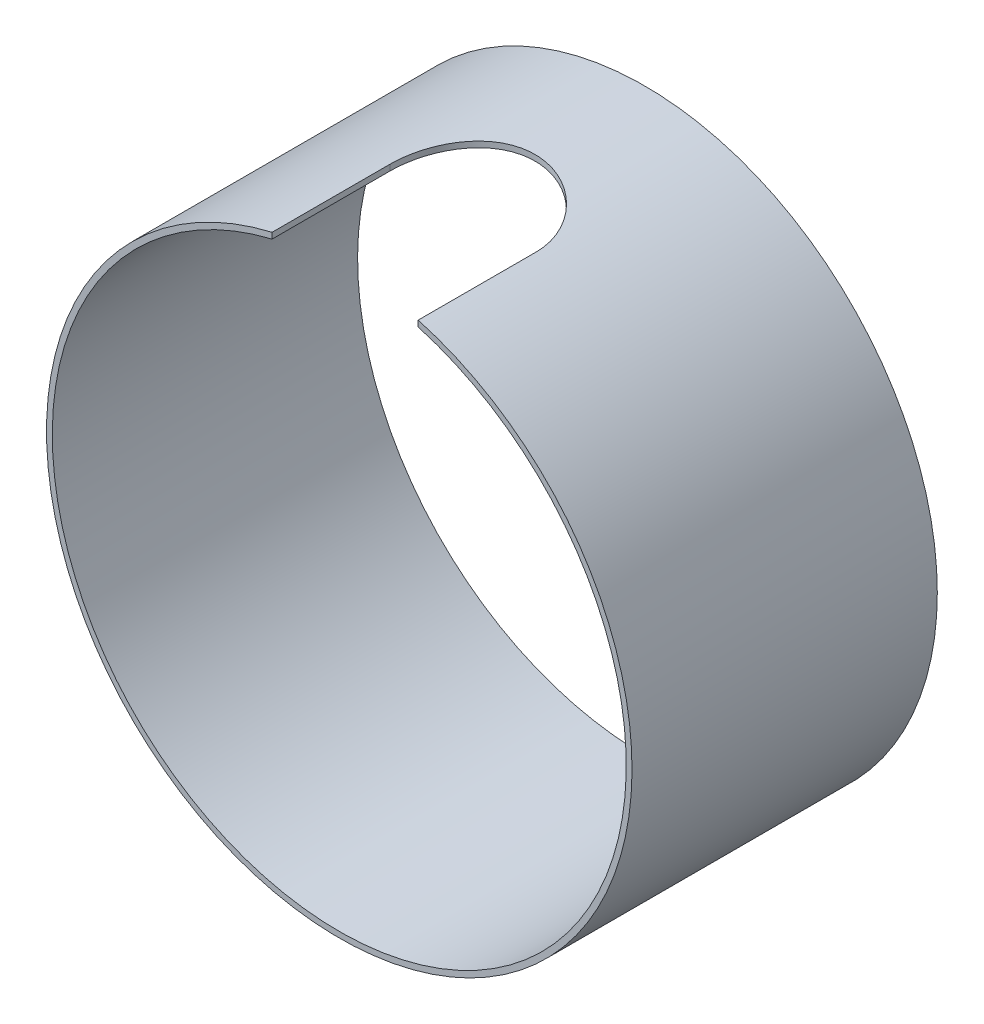
ISO-10303-21;
HEADER;
FILE_DESCRIPTION(('STEP AP214'),'2;1');
FILE_NAME('part.step','',(''),(''),'','','');
FILE_SCHEMA(('AUTOMOTIVE_DESIGN { 1 0 10303 214 1 1 1 1 }'));
ENDSEC;
DATA;
#1=APPLICATION_CONTEXT('core data for automotive mechanical design processes');
#2=APPLICATION_PROTOCOL_DEFINITION('international standard','automotive_design',2000,#1);
#3=PRODUCT_CONTEXT('',#1,'mechanical');
#4=PRODUCT('Part','Part','',(#3));
#5=PRODUCT_RELATED_PRODUCT_CATEGORY('part','',(#4));
#6=PRODUCT_DEFINITION_FORMATION('','',#4);
#7=PRODUCT_DEFINITION_CONTEXT('part definition',#1,'design');
#8=PRODUCT_DEFINITION('design','',#6,#7);
#9=PRODUCT_DEFINITION_SHAPE('','',#8);
#10=(LENGTH_UNIT() NAMED_UNIT(*) SI_UNIT(.MILLI.,.METRE.));
#11=(NAMED_UNIT(*) PLANE_ANGLE_UNIT() SI_UNIT($,.RADIAN.));
#12=(NAMED_UNIT(*) SI_UNIT($,.STERADIAN.) SOLID_ANGLE_UNIT());
#13=UNCERTAINTY_MEASURE_WITH_UNIT(LENGTH_MEASURE(1.E-05),#10,'distance_accuracy_value','');
#14=(GEOMETRIC_REPRESENTATION_CONTEXT(3) GLOBAL_UNCERTAINTY_ASSIGNED_CONTEXT((#13)) GLOBAL_UNIT_ASSIGNED_CONTEXT((#10,
#11,#12)) REPRESENTATION_CONTEXT('',''));
#15=CARTESIAN_POINT('',(0.,0.,0.));
#16=DIRECTION('',(0.,0.,1.));
#17=DIRECTION('',(1.,0.,0.));
#18=AXIS2_PLACEMENT_3D('',#15,#16,#17);
#19=CARTESIAN_POINT('',(0.,0.,53.));
#20=DIRECTION('',(0.,0.,1.));
#21=DIRECTION('',(1.,0.,0.));
#22=AXIS2_PLACEMENT_3D('',#19,#20,#21);
#23=PLANE('',#22);
#24=CARTESIAN_POINT('',(0.,0.,53.));
#25=DIRECTION('',(0.,0.,1.));
#26=DIRECTION('',(1.,0.,0.));
#27=AXIS2_PLACEMENT_3D('',#24,#25,#26);
#28=CIRCLE('',#27,49.8219999999989);
#29=CARTESIAN_POINT('',(-11.666,48.4369293824443,53.));
#30=VERTEX_POINT('',#29);
#31=CARTESIAN_POINT('',(13.698,47.9019465157721,53.));
#32=VERTEX_POINT('',#31);
#33=EDGE_CURVE('E106',#30,#32,#28,.T.);
#34=ORIENTED_EDGE('',*,*,#33,.F.);
#35=DIRECTION('',(0.,-1.,0.));
#36=VECTOR('',#35,1.);
#37=CARTESIAN_POINT('',(-11.666,50.8219999999989,53.));
#38=LINE('',#37,#36);
#39=CARTESIAN_POINT('',(-11.666,49.4649383705255,53.));
#40=VERTEX_POINT('',#39);
#41=EDGE_CURVE('E139',#40,#30,#38,.T.);
#42=ORIENTED_EDGE('',*,*,#41,.F.);
#43=CARTESIAN_POINT('',(0.,0.,53.));
#44=DIRECTION('',(0.,0.,1.));
#45=DIRECTION('',(1.,0.,0.));
#46=AXIS2_PLACEMENT_3D('',#43,#44,#45);
#47=CIRCLE('',#46,50.8219999999989);
#48=CARTESIAN_POINT('',(13.698,48.9411941006744,53.));
#49=VERTEX_POINT('',#48);
#50=EDGE_CURVE('E131',#40,#49,#47,.T.);
#51=ORIENTED_EDGE('',*,*,#50,.T.);
#52=DIRECTION('',(0.,-1.,0.));
#53=VECTOR('',#52,1.);
#54=CARTESIAN_POINT('',(13.698,50.8219999999989,53.));
#55=LINE('',#54,#53);
#56=EDGE_CURVE('E88',#49,#32,#55,.T.);
#57=ORIENTED_EDGE('',*,*,#56,.T.);
#58=EDGE_LOOP('',(#34,#42,#51,#57));
#59=FACE_BOUND('',#58,.T.);
#60=ADVANCED_FACE('F46',(#59),#23,.T.);
#61=CARTESIAN_POINT('',(0.,0.,53.));
#62=DIRECTION('',(0.,0.,-1.));
#63=DIRECTION('',(-1.,0.,0.));
#64=AXIS2_PLACEMENT_3D('',#61,#62,#63);
#65=CYLINDRICAL_SURFACE('',#64,50.8219999999989);
#66=CARTESIAN_POINT('',(0.,0.,0.));
#67=DIRECTION('',(0.,0.,1.));
#68=DIRECTION('',(1.,0.,0.));
#69=AXIS2_PLACEMENT_3D('',#66,#67,#68);
#70=CIRCLE('',#69,50.8219999999989);
#71=CARTESIAN_POINT('',(50.8219999999989,0.,0.));
#72=VERTEX_POINT('',#71);
#73=EDGE_CURVE('E132',#72,#72,#70,.T.);
#74=ORIENTED_EDGE('',*,*,#73,.T.);
#75=EDGE_LOOP('',(#74));
#76=FACE_BOUND('',#75,.T.);
#77=CARTESIAN_POINT('',(13.698,48.9411941006744,32.5));
#78=CARTESIAN_POINT('',(13.6980454225954,48.9411524108774,32.1504383082564));
#79=CARTESIAN_POINT('',(13.6835492648197,48.9452378230273,31.8008918293233));
#80=CARTESIAN_POINT('',(13.6258084428389,48.9613590809412,31.1044283770507));
#81=CARTESIAN_POINT('',(13.5825690715803,48.9733934629319,30.7575109314788));
#82=CARTESIAN_POINT('',(13.4678001595917,49.0050748931197,30.0695168420249));
#83=CARTESIAN_POINT('',(13.3963318406823,49.0247054651412,29.7284292138098));
#84=CARTESIAN_POINT('',(13.2257271453698,49.0710065278874,29.0537339386971));
#85=CARTESIAN_POINT('',(13.1265902974665,49.0976771385813,28.7201264193728));
#86=CARTESIAN_POINT('',(12.9014841382248,49.1573078605711,28.0627629157671));
#87=CARTESIAN_POINT('',(12.7755209762987,49.1902665302713,27.7390046931305));
#88=CARTESIAN_POINT('',(12.4977265951091,49.2615780091684,27.1033918825875));
#89=CARTESIAN_POINT('',(12.3458943210671,49.299931038302,26.7915377806906));
#90=CARTESIAN_POINT('',(12.0174418195833,49.3810224840999,26.1816620553631));
#91=CARTESIAN_POINT('',(11.8408149249567,49.4237620794625,25.8836441812223));
#92=CARTESIAN_POINT('',(11.4640394134145,49.5125128669298,25.3033849472157));
#93=CARTESIAN_POINT('',(11.2638904567124,49.558524106291,25.0211438153389));
#94=CARTESIAN_POINT('',(10.8366649689203,49.6537140939334,24.4680328993461));
#95=CARTESIAN_POINT('',(10.6090854652098,49.7029407214638,24.1975597472451));
#96=CARTESIAN_POINT('',(10.1321500572329,49.80235504214,23.6765241548594));
#97=CARTESIAN_POINT('',(9.88278477447491,49.8525431418564,23.4259703791358));
#98=CARTESIAN_POINT('',(9.36393184344992,49.9526001900818,22.9464686486268));
#99=CARTESIAN_POINT('',(9.09444045978736,50.0024690774711,22.7175247225601));
#100=CARTESIAN_POINT('',(8.53722887153213,50.1006126564053,22.2829049626335));
#101=CARTESIAN_POINT('',(8.24951677135125,50.1488880423909,22.077218895719));
#102=CARTESIAN_POINT('',(7.6519805455538,50.2435676030725,21.6867366312162));
#103=CARTESIAN_POINT('',(7.34184056292392,50.2899189321975,21.5024105489194));
#104=CARTESIAN_POINT('',(6.70652468874239,50.3785774793183,21.1606366119277));
#105=CARTESIAN_POINT('',(6.38134856243788,50.4208846341424,21.0031891770576));
#106=CARTESIAN_POINT('',(5.71826335632949,50.5003823396432,20.7164395574234));
#107=CARTESIAN_POINT('',(5.38035619862211,50.5375736587827,20.5871331438217));
#108=CARTESIAN_POINT('',(4.69417773153255,50.6059209520477,20.3577188835982));
#109=CARTESIAN_POINT('',(4.34590666892738,50.6370770697462,20.2576103423522));
#110=CARTESIAN_POINT('',(3.648326275906,50.6920649458773,20.0891074700721));
#111=CARTESIAN_POINT('',(3.29916527923788,50.7160258518728,20.0201411063099));
#112=CARTESIAN_POINT('',(2.59587532849459,50.7568830067635,19.9117633684382));
#113=CARTESIAN_POINT('',(2.24174642805878,50.7737793318758,19.8723516754712));
#114=CARTESIAN_POINT('',(1.53119663627342,50.8001722336846,19.8234665900804));
#115=CARTESIAN_POINT('',(1.17477603387521,50.8096697255129,19.8139894947246));
#116=CARTESIAN_POINT('',(0.462284040278048,50.8211463211636,19.8250854737403));
#117=CARTESIAN_POINT('',(0.10621264355029,50.8231255460048,19.8456580644059));
#118=CARTESIAN_POINT('',(-0.593808515340735,50.8197053256377,19.9157957126772));
#119=CARTESIAN_POINT('',(-0.937835212802277,50.8144935053792,19.9646049646542));
#120=CARTESIAN_POINT('',(-1.62055529666415,50.7973039100819,20.0902389730816));
#121=CARTESIAN_POINT('',(-1.95924878613963,50.785326265972,20.1670631873906));
#122=CARTESIAN_POINT('',(-2.62893387934175,50.7550662676502,20.3481317801677));
#123=CARTESIAN_POINT('',(-2.95992543798722,50.7367838765451,20.4523763190895));
#124=CARTESIAN_POINT('',(-3.61193848426382,50.6945393948566,20.6874891128181));
#125=CARTESIAN_POINT('',(-3.9329598558748,50.6705772382073,20.8183576773072));
#126=CARTESIAN_POINT('',(-4.56432120742104,50.6176202614121,21.1064015047811));
#127=CARTESIAN_POINT('',(-4.87460574144532,50.588602968094,21.2636941223828));
#128=CARTESIAN_POINT('',(-5.48090303526236,50.5265105114229,21.6030250022703));
#129=CARTESIAN_POINT('',(-5.77691578848842,50.4934353462027,21.7850632759417));
#130=CARTESIAN_POINT('',(-6.35273605408813,50.4242255579362,22.1725957637138));
#131=CARTESIAN_POINT('',(-6.63254535861698,50.388091274331,22.3780873762995));
#132=CARTESIAN_POINT('',(-7.17434555624851,50.3138079098279,22.8112581515327));
#133=CARTESIAN_POINT('',(-7.43632831595014,50.2756579231768,23.0389473281352));
#134=CARTESIAN_POINT('',(-7.94703330753043,50.1974975107936,23.5209401112043));
#135=CARTESIAN_POINT('',(-8.19525674513594,50.1574644248281,23.7757688122529));
#136=CARTESIAN_POINT('',(-8.66935010712692,50.0776979270882,24.3052848408339));
#137=CARTESIAN_POINT('',(-8.89522912803779,50.0379643994986,24.5799640076717));
#138=CARTESIAN_POINT('',(-9.32333089047202,49.9599696138503,25.1475995473096));
#139=CARTESIAN_POINT('',(-9.52554153208037,49.9217091154929,25.4405651523053));
#140=CARTESIAN_POINT('',(-9.90475440388766,49.8478570649903,26.0426915580892));
#141=CARTESIAN_POINT('',(-10.0817573477476,49.8122654372995,26.3518519000454));
#142=CARTESIAN_POINT('',(-10.4105847309102,49.7445859301594,26.9868223636662));
#143=CARTESIAN_POINT('',(-10.56219702799,49.7125282692785,27.3127456405836));
#144=CARTESIAN_POINT('',(-10.8373375410473,49.653273978078,27.976657892639));
#145=CARTESIAN_POINT('',(-10.9608667865226,49.626077169572,28.3146464249506));
#146=CARTESIAN_POINT('',(-11.1787266962204,49.5774567210634,28.9998760574088));
#147=CARTESIAN_POINT('',(-11.2730911771449,49.5560263985492,29.3471059306958));
#148=CARTESIAN_POINT('',(-11.4319945491871,49.5196104562927,30.0485131214938));
#149=CARTESIAN_POINT('',(-11.4965470400025,49.5046218981494,30.402687194164));
#150=CARTESIAN_POINT('',(-11.585914036153,49.4837753627867,31.0475187597601));
#151=CARTESIAN_POINT('',(-11.6159556200315,49.4767220346163,31.337424895159));
#152=CARTESIAN_POINT('',(-11.6559906649335,49.4672987712525,31.9182132510073));
#153=CARTESIAN_POINT('',(-11.6660170536206,49.4649211440039,32.2090930784206));
#154=CARTESIAN_POINT('',(-11.666,49.4649383705255,32.5));
#155=B_SPLINE_CURVE_WITH_KNOTS('',3,(#77,#78,#79,#80,#81,#82,#83,#84,#85,#86,#87,#88,#89,#90,
#91,#92,#93,#94,#95,#96,#97,#98,#99,#100,#101,#102,#103,#104,#105,#106,#107,#108,#109,#110,#111,
#112,#113,#114,#115,#116,#117,#118,#119,#120,#121,#122,#123,#124,#125,#126,#127,#128,#129,#130,
#131,#132,#133,#134,#135,#136,#137,#138,#139,#140,#141,#142,#143,#144,#145,#146,#147,#148,#149,
#150,#151,#152,#153,#154),.UNSPECIFIED.,.F.,.F.,(4,2,2,2,2,2,2,2,2,2,2,2,2,2,2,2,2,2,2,2,2,2,2,
2,2,2,2,2,2,2,2,2,2,2,2,2,2,2,4),(0.,1.04833749074011,2.09648198782412,3.14236568333263,
4.18826720286361,5.23392922731606,6.2796338974556,7.3256202943924,8.37162180292264,
9.44106665801133,10.5109741852073,11.581080782648,12.6507147044947,13.7406327260351,
14.8305677697471,15.9203389123084,17.0100841268417,18.07890529856,19.1477149388871,
20.2163923614877,21.2850525819136,22.3263509740737,23.3676292162491,24.4089135517344,
25.4502099998041,26.4962596235569,27.5423097286106,28.5882439152032,29.6346521554509,
30.7073610165226,31.7796313594592,32.8524475036148,33.9252332689819,35.0065778013389,
36.0878826862492,37.1679290473743,38.2474822227675,39.1214077232767,39.9938943111024),.UNSPECIFIED.);
#156=CARTESIAN_POINT('',(13.698,48.9411941006744,32.5));
#157=VERTEX_POINT('',#156);
#158=CARTESIAN_POINT('',(-11.666,49.4649383705255,32.5));
#159=VERTEX_POINT('',#158);
#160=EDGE_CURVE('E98',#157,#159,#155,.T.);
#161=ORIENTED_EDGE('',*,*,#160,.F.);
#162=DIRECTION('',(0.,0.,-1.));
#163=VECTOR('',#162,1.);
#164=CARTESIAN_POINT('',(13.698,48.9411941006744,53.));
#165=LINE('',#164,#163);
#166=EDGE_CURVE('E85',#49,#157,#165,.T.);
#167=ORIENTED_EDGE('',*,*,#166,.F.);
#168=ORIENTED_EDGE('',*,*,#50,.F.);
#169=DIRECTION('',(0.,0.,-1.));
#170=VECTOR('',#169,1.);
#171=CARTESIAN_POINT('',(-11.666,49.4649383705255,53.));
#172=LINE('',#171,#170);
#173=EDGE_CURVE('E93',#159,#40,#172,.F.);
#174=ORIENTED_EDGE('',*,*,#173,.F.);
#175=EDGE_LOOP('',(#161,#167,#168,#174));
#176=FACE_BOUND('',#175,.T.);
#177=ADVANCED_FACE('F48',(#76,#176),#65,.T.);
#178=CARTESIAN_POINT('',(0.,0.,53.));
#179=DIRECTION('',(0.,0.,-1.));
#180=DIRECTION('',(-1.,0.,0.));
#181=AXIS2_PLACEMENT_3D('',#178,#179,#180);
#182=CYLINDRICAL_SURFACE('',#181,49.8219999999989);
#183=CARTESIAN_POINT('',(0.,0.,0.));
#184=DIRECTION('',(0.,0.,1.));
#185=DIRECTION('',(1.,0.,0.));
#186=AXIS2_PLACEMENT_3D('',#183,#184,#185);
#187=CIRCLE('',#186,49.8219999999989);
#188=CARTESIAN_POINT('',(49.8219999999989,0.,0.));
#189=VERTEX_POINT('',#188);
#190=EDGE_CURVE('E103',#189,#189,#187,.T.);
#191=ORIENTED_EDGE('',*,*,#190,.F.);
#192=EDGE_LOOP('',(#191));
#193=FACE_BOUND('',#192,.T.);
#194=CARTESIAN_POINT('',(13.698,47.9019465157721,32.5));
#195=CARTESIAN_POINT('',(13.6980457069861,47.901903855572,32.1507304940753));
#196=CARTESIAN_POINT('',(13.6835734329337,47.9060710599627,31.8014766155169));
#197=CARTESIAN_POINT('',(13.6259299081092,47.9225142524478,31.1056017502683));
#198=CARTESIAN_POINT('',(13.5827641083706,47.9347887003711,30.7589802761367));
#199=CARTESIAN_POINT('',(13.4681973254465,47.9670998236446,30.0715995027458));
#200=CARTESIAN_POINT('',(13.396859104879,47.987119242716,29.7308289178644));
#201=CARTESIAN_POINT('',(13.2265727033518,48.0343346872794,29.0567659423634));
#202=CARTESIAN_POINT('',(13.1276240168847,48.0615308441666,28.7234736887818));
#203=CARTESIAN_POINT('',(12.9029584530448,48.1223322113983,28.0667434007631));
#204=CARTESIAN_POINT('',(12.7772484885421,48.1559357663752,27.74330284609));
#205=CARTESIAN_POINT('',(12.5000245348836,48.2286387490666,27.1083091998119));
#206=CARTESIAN_POINT('',(12.3485094664359,48.2677384066424,26.796756606085));
#207=CARTESIAN_POINT('',(12.0207519064975,48.3504060390575,26.1874516859645));
#208=CARTESIAN_POINT('',(11.8445023065165,48.3939752974498,25.8897033596395));
#209=CARTESIAN_POINT('',(11.468540587796,48.4844473105217,25.3099448575029));
#210=CARTESIAN_POINT('',(11.2688281135527,48.5313501157062,25.0279349202512));
#211=CARTESIAN_POINT('',(10.8423432277493,48.6284299511436,24.4749866777665));
#212=CARTESIAN_POINT('',(10.6150480356661,48.6786578510037,24.2044604055543));
#213=CARTESIAN_POINT('',(10.1386889971685,48.7800982213562,23.6832908088571));
#214=CARTESIAN_POINT('',(9.88961577451519,48.8313111084462,23.4326561379063));
#215=CARTESIAN_POINT('',(9.37134617267753,48.9334170963603,22.9529578600624));
#216=CARTESIAN_POINT('',(9.10214603124098,48.9843101354593,22.7238983043019));
#217=CARTESIAN_POINT('',(8.54550666153212,49.0844774091162,22.289008685408));
#218=CARTESIAN_POINT('',(8.25807553586258,49.1337523482493,22.0831684141272));
#219=CARTESIAN_POINT('',(7.66084501927908,49.2304420446747,21.6921765340635));
#220=CARTESIAN_POINT('',(7.35071565986347,49.2778007353468,21.507514632373));
#221=CARTESIAN_POINT('',(6.71536737455665,49.3683955626777,21.1650730338908));
#222=CARTESIAN_POINT('',(6.39014820302725,49.4116316321917,21.0072937749015));
#223=CARTESIAN_POINT('',(5.72692182492084,49.492884696021,20.7198925030931));
#224=CARTESIAN_POINT('',(5.38891659436064,49.5309024926229,20.5902661600977));
#225=CARTESIAN_POINT('',(4.70248653050678,49.6007792189894,20.3602324464986));
#226=CARTESIAN_POINT('',(4.3540619558196,49.6326383014661,20.2598243513654));
#227=CARTESIAN_POINT('',(3.65638607217287,49.6888573982756,20.0908205388667));
#228=CARTESIAN_POINT('',(3.30728973290096,49.7133542554757,20.0216305002514));
#229=CARTESIAN_POINT('',(2.60409274623497,49.7551447438825,19.9127977412443));
#230=CARTESIAN_POINT('',(2.24999215495635,49.7724384557957,19.8731546897931));
#231=CARTESIAN_POINT('',(1.53946912781992,49.7994788662905,19.8238054564047));
#232=CARTESIAN_POINT('',(1.18304699888367,49.8092265428713,19.8140953945343));
#233=CARTESIAN_POINT('',(0.470526316384187,49.8210521443374,19.824727794354));
#234=CARTESIAN_POINT('',(0.11442775748569,49.8231301980668,19.845069751184));
#235=CARTESIAN_POINT('',(-0.585300218812174,49.8197576723685,19.9147199675347));
#236=CARTESIAN_POINT('',(-0.929009138481961,49.8145061309976,19.9632423306533));
#237=CARTESIAN_POINT('',(-1.61111923940525,49.7971120860733,20.0882479323656));
#238=CARTESIAN_POINT('',(-1.94952052742384,49.7849697213147,20.1647306077725));
#239=CARTESIAN_POINT('',(-2.61864963582111,49.7542615265383,20.3450621693946));
#240=CARTESIAN_POINT('',(-2.94937741277725,49.735695660181,20.4489112104284));
#241=CARTESIAN_POINT('',(-3.60089578656822,49.6927743924862,20.6831797330184));
#242=CARTESIAN_POINT('',(-3.92168626393082,49.6684189215732,20.8135995338817));
#243=CARTESIAN_POINT('',(-4.55265311686199,49.6145721208781,21.1007050806816));
#244=CARTESIAN_POINT('',(-4.86277308430141,49.5850573940117,21.2575103574216));
#245=CARTESIAN_POINT('',(-5.46878497908468,49.5218830490416,21.595821089198));
#246=CARTESIAN_POINT('',(-5.76467690071554,49.4882234292736,21.7773265541521));
#247=CARTESIAN_POINT('',(-6.3403091350139,49.4177725934887,22.1637532022263));
#248=CARTESIAN_POINT('',(-6.62005114299395,49.3809817071786,22.3686719208235));
#249=CARTESIAN_POINT('',(-7.1617772341011,49.3053291095487,22.8006617240456));
#250=CARTESIAN_POINT('',(-7.42375320860555,49.2664664669171,23.0277428100284));
#251=CARTESIAN_POINT('',(-7.93476263659886,49.1867852420269,23.5087110458361));
#252=CARTESIAN_POINT('',(-8.18327936475584,49.1459420846461,23.7631434050519));
#253=CARTESIAN_POINT('',(-8.65799594181784,49.0645368982231,24.2918875710524));
#254=CARTESIAN_POINT('',(-8.88420485065695,49.0239747613242,24.566191228287));
#255=CARTESIAN_POINT('',(-9.31300507988763,48.9443276983951,25.1331041599505));
#256=CARTESIAN_POINT('',(-9.51558431422342,48.9052435351625,25.4257226854802));
#257=CARTESIAN_POINT('',(-9.89557261461754,48.8297743585535,26.0271921326343));
#258=CARTESIAN_POINT('',(-10.0729823870671,48.7933892694402,26.3360425983693));
#259=CARTESIAN_POINT('',(-10.4027363014556,48.7241562416013,26.9705787466983));
#260=CARTESIAN_POINT('',(-10.5548565843732,48.6913406990854,27.296384380252));
#261=CARTESIAN_POINT('',(-10.831018267992,48.630656263735,27.9601237713625));
#262=CARTESIAN_POINT('',(-10.9550607161674,48.6027871863755,28.2980570759381));
#263=CARTESIAN_POINT('',(-11.1739437025214,48.5529326627824,28.9832408537556));
#264=CARTESIAN_POINT('',(-11.2688179982872,48.5309404189179,29.3304800467912));
#265=CARTESIAN_POINT('',(-11.4287288916822,48.4935312426777,30.0319667023945));
#266=CARTESIAN_POINT('',(-11.4937790556099,48.4781113209318,30.386210901903));
#267=CARTESIAN_POINT('',(-11.5843904090251,48.4565310402525,31.0338120113867));
#268=CARTESIAN_POINT('',(-11.6150028667194,48.449191829478,31.3264337275857));
#269=CARTESIAN_POINT('',(-11.6557999935612,48.439385781114,31.9126962418723));
#270=CARTESIAN_POINT('',(-11.6660180370789,48.4369109832733,32.2063345859968));
#271=CARTESIAN_POINT('',(-11.666,48.4369293824443,32.5));
#272=B_SPLINE_CURVE_WITH_KNOTS('',3,(#194,#195,#196,#197,#198,#199,#200,#201,#202,#203,#204,
#205,#206,#207,#208,#209,#210,#211,#212,#213,#214,#215,#216,#217,#218,#219,#220,#221,#222,#223,
#224,#225,#226,#227,#228,#229,#230,#231,#232,#233,#234,#235,#236,#237,#238,#239,#240,#241,#242,
#243,#244,#245,#246,#247,#248,#249,#250,#251,#252,#253,#254,#255,#256,#257,#258,#259,#260,#261,
#262,#263,#264,#265,#266,#267,#268,#269,#270,#271),.UNSPECIFIED.,.F.,.F.,(4,2,2,2,2,2,2,2,2,2,2,
2,2,2,2,2,2,2,2,2,2,2,2,2,2,2,2,2,2,2,2,2,2,2,2,2,2,2,4),(0.,1.04746002361657,2.09472111355847,
3.13966215525105,4.18462232954479,5.22931290058747,6.27404717627947,7.31908231677712,
8.36413329344275,9.43357552864742,10.5034804866429,11.5735859405445,12.6432190834617,
13.7340077398712,14.8248141588227,15.9154526827498,17.0060641596309,18.0749325671918,
19.1437889984324,20.212506877994,21.2812068037875,22.3214437608961,23.3616597663257,
24.4018816566521,25.4421160483083,26.4871964225177,27.5322772163557,28.577248104204,
29.6226927628543,30.6954417827363,31.7677533142595,32.8406109264939,33.9134384225802,
34.9953078717418,36.0771369539346,37.1577092330233,38.2377894962513,39.1199909617399,
40.0007475640694),.UNSPECIFIED.);
#273=CARTESIAN_POINT('',(13.698,47.9019465157721,32.5));
#274=VERTEX_POINT('',#273);
#275=CARTESIAN_POINT('',(-11.666,48.4369293824443,32.5));
#276=VERTEX_POINT('',#275);
#277=EDGE_CURVE('E55',#274,#276,#272,.T.);
#278=ORIENTED_EDGE('',*,*,#277,.T.);
#279=DIRECTION('',(0.,0.,-1.));
#280=VECTOR('',#279,1.);
#281=CARTESIAN_POINT('',(-11.666,48.4369293824443,53.));
#282=LINE('',#281,#280);
#283=EDGE_CURVE('E13',#276,#30,#282,.F.);
#284=ORIENTED_EDGE('',*,*,#283,.T.);
#285=ORIENTED_EDGE('',*,*,#33,.T.);
#286=DIRECTION('',(0.,0.,-1.));
#287=VECTOR('',#286,1.);
#288=CARTESIAN_POINT('',(13.698,47.9019465157721,53.));
#289=LINE('',#288,#287);
#290=EDGE_CURVE('E129',#32,#274,#289,.T.);
#291=ORIENTED_EDGE('',*,*,#290,.T.);
#292=EDGE_LOOP('',(#278,#284,#285,#291));
#293=FACE_BOUND('',#292,.T.);
#294=ADVANCED_FACE('F121',(#193,#293),#182,.F.);
#295=CARTESIAN_POINT('',(0.,0.,0.));
#296=DIRECTION('',(0.,0.,1.));
#297=DIRECTION('',(1.,0.,0.));
#298=AXIS2_PLACEMENT_3D('',#295,#296,#297);
#299=PLANE('',#298);
#300=ORIENTED_EDGE('',*,*,#73,.F.);
#301=EDGE_LOOP('',(#300));
#302=FACE_BOUND('',#301,.T.);
#303=ORIENTED_EDGE('',*,*,#190,.T.);
#304=EDGE_LOOP('',(#303));
#305=FACE_BOUND('',#304,.T.);
#306=ADVANCED_FACE('F119',(#302,#305),#299,.F.);
#307=CARTESIAN_POINT('',(1.01599999999999,50.8219999999989,32.5));
#308=DIRECTION('',(0.,-1.,0.));
#309=DIRECTION('',(0.,0.,-1.));
#310=AXIS2_PLACEMENT_3D('',#307,#308,#309);
#311=CYLINDRICAL_SURFACE('',#310,12.682);
#312=ORIENTED_EDGE('',*,*,#160,.T.);
#313=DIRECTION('',(0.,-1.,0.));
#314=VECTOR('',#313,1.);
#315=CARTESIAN_POINT('',(-11.666,50.8219999999989,32.5));
#316=LINE('',#315,#314);
#317=EDGE_CURVE('E94',#159,#276,#316,.T.);
#318=ORIENTED_EDGE('',*,*,#317,.T.);
#319=ORIENTED_EDGE('',*,*,#277,.F.);
#320=DIRECTION('',(0.,-1.,0.));
#321=VECTOR('',#320,1.);
#322=CARTESIAN_POINT('',(13.698,50.8219999999989,32.5));
#323=LINE('',#322,#321);
#324=EDGE_CURVE('E62',#157,#274,#323,.T.);
#325=ORIENTED_EDGE('',*,*,#324,.F.);
#326=EDGE_LOOP('',(#312,#318,#319,#325));
#327=FACE_BOUND('',#326,.T.);
#328=ADVANCED_FACE('F97',(#327),#311,.F.);
#329=CARTESIAN_POINT('',(-11.666,50.8219999999989,32.5));
#330=DIRECTION('',(1.,0.,0.));
#331=DIRECTION('',(0.,0.,-1.));
#332=AXIS2_PLACEMENT_3D('',#329,#330,#331);
#333=PLANE('',#332);
#334=ORIENTED_EDGE('',*,*,#173,.T.);
#335=ORIENTED_EDGE('',*,*,#41,.T.);
#336=ORIENTED_EDGE('',*,*,#283,.F.);
#337=ORIENTED_EDGE('',*,*,#317,.F.);
#338=EDGE_LOOP('',(#334,#335,#336,#337));
#339=FACE_BOUND('',#338,.T.);
#340=ADVANCED_FACE('F118',(#339),#333,.T.);
#341=CARTESIAN_POINT('',(13.698,50.8219999999989,53.));
#342=DIRECTION('',(-1.,0.,0.));
#343=DIRECTION('',(0.,0.,1.));
#344=AXIS2_PLACEMENT_3D('',#341,#342,#343);
#345=PLANE('',#344);
#346=ORIENTED_EDGE('',*,*,#166,.T.);
#347=ORIENTED_EDGE('',*,*,#324,.T.);
#348=ORIENTED_EDGE('',*,*,#290,.F.);
#349=ORIENTED_EDGE('',*,*,#56,.F.);
#350=EDGE_LOOP('',(#346,#347,#348,#349));
#351=FACE_BOUND('',#350,.T.);
#352=ADVANCED_FACE('F86',(#351),#345,.T.);
#353=CLOSED_SHELL('',(#60,#177,#294,#306,#328,#340,#352));
#354=MANIFOLD_SOLID_BREP('B2',#353);
#355=ADVANCED_BREP_SHAPE_REPRESENTATION('',(#18,#354),#14);
#356=SHAPE_DEFINITION_REPRESENTATION(#9,#355);
ENDSEC;
END-ISO-10303-21;
